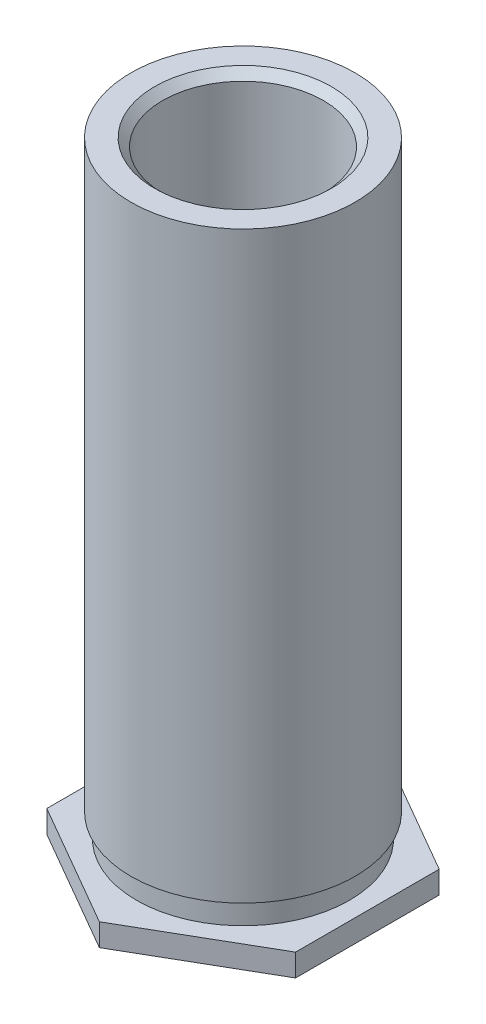
ISO-10303-21;
HEADER;
FILE_DESCRIPTION(('STEP AP214'),'2;1');
FILE_NAME('part.step','',(''),(''),'','','');
FILE_SCHEMA(('AUTOMOTIVE_DESIGN { 1 0 10303 214 1 1 1 1 }'));
ENDSEC;
DATA;
#1=APPLICATION_CONTEXT('core data for automotive mechanical design processes');
#2=APPLICATION_PROTOCOL_DEFINITION('international standard','automotive_design',2000,#1);
#3=PRODUCT_CONTEXT('',#1,'mechanical');
#4=PRODUCT('Part','Part','',(#3));
#5=PRODUCT_RELATED_PRODUCT_CATEGORY('part','',(#4));
#6=PRODUCT_DEFINITION_FORMATION('','',#4);
#7=PRODUCT_DEFINITION_CONTEXT('part definition',#1,'design');
#8=PRODUCT_DEFINITION('design','',#6,#7);
#9=PRODUCT_DEFINITION_SHAPE('','',#8);
#10=(LENGTH_UNIT() NAMED_UNIT(*) SI_UNIT(.MILLI.,.METRE.));
#11=(NAMED_UNIT(*) PLANE_ANGLE_UNIT() SI_UNIT($,.RADIAN.));
#12=(NAMED_UNIT(*) SI_UNIT($,.STERADIAN.) SOLID_ANGLE_UNIT());
#13=UNCERTAINTY_MEASURE_WITH_UNIT(LENGTH_MEASURE(1.E-05),#10,'distance_accuracy_value','');
#14=(GEOMETRIC_REPRESENTATION_CONTEXT(3) GLOBAL_UNCERTAINTY_ASSIGNED_CONTEXT((#13)) GLOBAL_UNIT_ASSIGNED_CONTEXT((#10,
#11,#12)) REPRESENTATION_CONTEXT('',''));
#15=CARTESIAN_POINT('',(0.,0.,0.));
#16=DIRECTION('',(0.,0.,1.));
#17=DIRECTION('',(1.,0.,0.));
#18=AXIS2_PLACEMENT_3D('',#15,#16,#17);
#19=CARTESIAN_POINT('',(4.582,0.712,0.));
#20=DIRECTION('',(0.,1.,0.));
#21=DIRECTION('',(0.,0.,1.));
#22=AXIS2_PLACEMENT_3D('',#19,#20,#21);
#23=PLANE('',#22);
#24=CARTESIAN_POINT('',(0.,0.712,0.));
#25=DIRECTION('',(0.,-1.,0.));
#26=DIRECTION('',(0.,0.,-1.));
#27=AXIS2_PLACEMENT_3D('',#24,#25,#26);
#28=CIRCLE('',#27,3.382);
#29=CARTESIAN_POINT('',(0.,0.712,-3.382));
#30=VERTEX_POINT('',#29);
#31=EDGE_CURVE('E143',#30,#30,#28,.T.);
#32=ORIENTED_EDGE('',*,*,#31,.T.);
#33=EDGE_LOOP('',(#32));
#34=FACE_BOUND('',#33,.T.);
#35=DIRECTION('',(0.866025403784439,0.,0.5));
#36=VECTOR('',#35,1.);
#37=CARTESIAN_POINT('',(0.,0.712,4.56106712659804));
#38=LINE('',#37,#36);
#39=CARTESIAN_POINT('',(-3.95,0.712,2.28053356329902));
#40=VERTEX_POINT('',#39);
#41=CARTESIAN_POINT('',(0.,0.712,4.56106712659804));
#42=VERTEX_POINT('',#41);
#43=EDGE_CURVE('E127',#40,#42,#38,.T.);
#44=ORIENTED_EDGE('',*,*,#43,.T.);
#45=DIRECTION('',(0.866025403784439,0.,-0.5));
#46=VECTOR('',#45,1.);
#47=CARTESIAN_POINT('',(3.95,0.712,2.28053356329902));
#48=LINE('',#47,#46);
#49=CARTESIAN_POINT('',(3.95,0.712,2.28053356329902));
#50=VERTEX_POINT('',#49);
#51=EDGE_CURVE('E116',#42,#50,#48,.T.);
#52=ORIENTED_EDGE('',*,*,#51,.T.);
#53=DIRECTION('',(0.,0.,-1.));
#54=VECTOR('',#53,1.);
#55=CARTESIAN_POINT('',(3.95,0.712,-2.28053356329902));
#56=LINE('',#55,#54);
#57=CARTESIAN_POINT('',(3.95,0.712,-2.28053356329902));
#58=VERTEX_POINT('',#57);
#59=EDGE_CURVE('E119',#50,#58,#56,.T.);
#60=ORIENTED_EDGE('',*,*,#59,.T.);
#61=DIRECTION('',(-0.866025403784439,0.,-0.5));
#62=VECTOR('',#61,1.);
#63=CARTESIAN_POINT('',(0.,0.712,-4.56106712659804));
#64=LINE('',#63,#62);
#65=CARTESIAN_POINT('',(0.,0.712,-4.56106712659804));
#66=VERTEX_POINT('',#65);
#67=EDGE_CURVE('E47',#58,#66,#64,.T.);
#68=ORIENTED_EDGE('',*,*,#67,.T.);
#69=DIRECTION('',(-0.866025403784439,0.,0.5));
#70=VECTOR('',#69,1.);
#71=CARTESIAN_POINT('',(-3.95,0.712,-2.28053356329902));
#72=LINE('',#71,#70);
#73=CARTESIAN_POINT('',(-3.95,0.712,-2.28053356329902));
#74=VERTEX_POINT('',#73);
#75=EDGE_CURVE('E92',#66,#74,#72,.T.);
#76=ORIENTED_EDGE('',*,*,#75,.T.);
#77=DIRECTION('',(0.,0.,1.));
#78=VECTOR('',#77,1.);
#79=CARTESIAN_POINT('',(-3.95,0.712,2.28053356329902));
#80=LINE('',#79,#78);
#81=EDGE_CURVE('E124',#74,#40,#80,.T.);
#82=ORIENTED_EDGE('',*,*,#81,.T.);
#83=EDGE_LOOP('',(#44,#52,#60,#68,#76,#82));
#84=FACE_BOUND('',#83,.T.);
#85=ADVANCED_FACE('F32',(#34,#84),#23,.T.);
#86=CARTESIAN_POINT('',(3.56,0.,0.));
#87=DIRECTION('',(0.,-1.,0.));
#88=DIRECTION('',(0.,0.,-1.));
#89=AXIS2_PLACEMENT_3D('',#86,#87,#88);
#90=PLANE('',#89);
#91=CARTESIAN_POINT('',(0.,0.,0.));
#92=DIRECTION('',(0.,-1.,0.));
#93=DIRECTION('',(0.,0.,-1.));
#94=AXIS2_PLACEMENT_3D('',#91,#92,#93);
#95=CIRCLE('',#94,3.56);
#96=CARTESIAN_POINT('',(0.,0.,-3.56));
#97=VERTEX_POINT('',#96);
#98=EDGE_CURVE('E140',#97,#97,#95,.T.);
#99=ORIENTED_EDGE('',*,*,#98,.F.);
#100=EDGE_LOOP('',(#99));
#101=FACE_BOUND('',#100,.T.);
#102=DIRECTION('',(0.,0.,-1.));
#103=VECTOR('',#102,1.);
#104=CARTESIAN_POINT('',(3.95,0.,-2.28053356329902));
#105=LINE('',#104,#103);
#106=CARTESIAN_POINT('',(3.95,0.,2.28053356329902));
#107=VERTEX_POINT('',#106);
#108=CARTESIAN_POINT('',(3.95,0.,-2.28053356329902));
#109=VERTEX_POINT('',#108);
#110=EDGE_CURVE('E102',#107,#109,#105,.T.);
#111=ORIENTED_EDGE('',*,*,#110,.F.);
#112=DIRECTION('',(0.866025403784439,0.,-0.5));
#113=VECTOR('',#112,1.);
#114=CARTESIAN_POINT('',(3.95,0.,2.28053356329902));
#115=LINE('',#114,#113);
#116=CARTESIAN_POINT('',(0.,0.,4.56106712659804));
#117=VERTEX_POINT('',#116);
#118=EDGE_CURVE('E55',#117,#107,#115,.T.);
#119=ORIENTED_EDGE('',*,*,#118,.F.);
#120=DIRECTION('',(0.866025403784439,0.,0.5));
#121=VECTOR('',#120,1.);
#122=CARTESIAN_POINT('',(0.,0.,4.56106712659804));
#123=LINE('',#122,#121);
#124=CARTESIAN_POINT('',(-3.95,0.,2.28053356329902));
#125=VERTEX_POINT('',#124);
#126=EDGE_CURVE('E109',#125,#117,#123,.T.);
#127=ORIENTED_EDGE('',*,*,#126,.F.);
#128=DIRECTION('',(0.,0.,1.));
#129=VECTOR('',#128,1.);
#130=CARTESIAN_POINT('',(-3.95,0.,2.28053356329902));
#131=LINE('',#130,#129);
#132=CARTESIAN_POINT('',(-3.95,0.,-2.28053356329902));
#133=VERTEX_POINT('',#132);
#134=EDGE_CURVE('E107',#133,#125,#131,.T.);
#135=ORIENTED_EDGE('',*,*,#134,.F.);
#136=DIRECTION('',(-0.866025403784439,0.,0.5));
#137=VECTOR('',#136,1.);
#138=CARTESIAN_POINT('',(-3.95,0.,-2.28053356329902));
#139=LINE('',#138,#137);
#140=CARTESIAN_POINT('',(0.,0.,-4.56106712659804));
#141=VERTEX_POINT('',#140);
#142=EDGE_CURVE('E89',#141,#133,#139,.T.);
#143=ORIENTED_EDGE('',*,*,#142,.F.);
#144=DIRECTION('',(-0.866025403784439,0.,-0.5));
#145=VECTOR('',#144,1.);
#146=CARTESIAN_POINT('',(0.,0.,-4.56106712659804));
#147=LINE('',#146,#145);
#148=EDGE_CURVE('E97',#109,#141,#147,.T.);
#149=ORIENTED_EDGE('',*,*,#148,.F.);
#150=EDGE_LOOP('',(#111,#119,#127,#135,#143,#149));
#151=FACE_BOUND('',#150,.T.);
#152=ADVANCED_FACE('F104',(#101,#151),#90,.T.);
#153=CARTESIAN_POINT('',(2.805,0.00507999999999709,0.));
#154=DIRECTION('',(0.,-1.,0.));
#155=DIRECTION('',(0.,0.,-1.));
#156=AXIS2_PLACEMENT_3D('',#153,#154,#155);
#157=PLANE('',#156);
#158=CARTESIAN_POINT('',(0.,0.00507999999999709,0.));
#159=DIRECTION('',(0.,-1.,0.));
#160=DIRECTION('',(0.,0.,-1.));
#161=AXIS2_PLACEMENT_3D('',#158,#159,#160);
#162=CIRCLE('',#161,3.56);
#163=CARTESIAN_POINT('',(0.,0.00507999999999709,-3.56));
#164=VERTEX_POINT('',#163);
#165=EDGE_CURVE('E132',#164,#164,#162,.T.);
#166=ORIENTED_EDGE('',*,*,#165,.T.);
#167=EDGE_LOOP('',(#166));
#168=FACE_BOUND('',#167,.T.);
#169=CARTESIAN_POINT('',(0.,0.00507999999999709,0.));
#170=DIRECTION('',(0.,-1.,0.));
#171=DIRECTION('',(0.,0.,-1.));
#172=AXIS2_PLACEMENT_3D('',#169,#170,#171);
#173=CIRCLE('',#172,2.805);
#174=CARTESIAN_POINT('',(0.,0.00507999999999709,-2.805));
#175=VERTEX_POINT('',#174);
#176=EDGE_CURVE('E11',#175,#175,#173,.T.);
#177=ORIENTED_EDGE('',*,*,#176,.F.);
#178=EDGE_LOOP('',(#177));
#179=FACE_BOUND('',#178,.T.);
#180=ADVANCED_FACE('F34',(#168,#179),#157,.T.);
#181=CARTESIAN_POINT('',(0.,0.26008,0.));
#182=DIRECTION('',(0.,-1.,0.));
#183=DIRECTION('',(0.,0.,-1.));
#184=AXIS2_PLACEMENT_3D('',#181,#182,#183);
#185=CONICAL_SURFACE('',#184,2.55,0.785398163397448);
#186=ORIENTED_EDGE('',*,*,#176,.T.);
#187=EDGE_LOOP('',(#186));
#188=FACE_BOUND('',#187,.T.);
#189=CARTESIAN_POINT('',(0.,0.26008,0.));
#190=DIRECTION('',(0.,-1.,0.));
#191=DIRECTION('',(0.,0.,-1.));
#192=AXIS2_PLACEMENT_3D('',#189,#190,#191);
#193=CIRCLE('',#192,2.55);
#194=CARTESIAN_POINT('',(0.,0.26008,-2.55));
#195=VERTEX_POINT('',#194);
#196=EDGE_CURVE('E40',#195,#195,#193,.T.);
#197=ORIENTED_EDGE('',*,*,#196,.F.);
#198=EDGE_LOOP('',(#197));
#199=FACE_BOUND('',#198,.T.);
#200=ADVANCED_FACE('F166',(#188,#199),#185,.F.);
#201=CARTESIAN_POINT('',(0.,0.,0.));
#202=DIRECTION('',(0.,-1.,0.));
#203=DIRECTION('',(0.,0.,-1.));
#204=AXIS2_PLACEMENT_3D('',#201,#202,#203);
#205=CYLINDRICAL_SURFACE('',#204,2.55);
#206=ORIENTED_EDGE('',*,*,#196,.T.);
#207=EDGE_LOOP('',(#206));
#208=FACE_BOUND('',#207,.T.);
#209=CARTESIAN_POINT('',(0.,19.745,0.));
#210=DIRECTION('',(0.,-1.,0.));
#211=DIRECTION('',(0.,0.,-1.));
#212=AXIS2_PLACEMENT_3D('',#209,#210,#211);
#213=CIRCLE('',#212,2.55);
#214=CARTESIAN_POINT('',(0.,19.745,-2.55));
#215=VERTEX_POINT('',#214);
#216=EDGE_CURVE('E158',#215,#215,#213,.T.);
#217=ORIENTED_EDGE('',*,*,#216,.F.);
#218=EDGE_LOOP('',(#217));
#219=FACE_BOUND('',#218,.T.);
#220=ADVANCED_FACE('F163',(#208,#219),#205,.F.);
#221=CARTESIAN_POINT('',(0.,20.,0.));
#222=DIRECTION('',(0.,1.,0.));
#223=DIRECTION('',(0.,0.,1.));
#224=AXIS2_PLACEMENT_3D('',#221,#222,#223);
#225=CONICAL_SURFACE('',#224,2.805,0.78539816339745);
#226=ORIENTED_EDGE('',*,*,#216,.T.);
#227=EDGE_LOOP('',(#226));
#228=FACE_BOUND('',#227,.T.);
#229=CARTESIAN_POINT('',(0.,20.,0.));
#230=DIRECTION('',(0.,-1.,0.));
#231=DIRECTION('',(0.,0.,-1.));
#232=AXIS2_PLACEMENT_3D('',#229,#230,#231);
#233=CIRCLE('',#232,2.805);
#234=CARTESIAN_POINT('',(0.,20.,-2.805));
#235=VERTEX_POINT('',#234);
#236=EDGE_CURVE('E155',#235,#235,#233,.T.);
#237=ORIENTED_EDGE('',*,*,#236,.F.);
#238=EDGE_LOOP('',(#237));
#239=FACE_BOUND('',#238,.T.);
#240=ADVANCED_FACE('F173',(#228,#239),#225,.F.);
#241=CARTESIAN_POINT('',(3.56,20.,0.));
#242=DIRECTION('',(0.,1.,0.));
#243=DIRECTION('',(0.,0.,1.));
#244=AXIS2_PLACEMENT_3D('',#241,#242,#243);
#245=PLANE('',#244);
#246=ORIENTED_EDGE('',*,*,#236,.T.);
#247=EDGE_LOOP('',(#246));
#248=FACE_BOUND('',#247,.T.);
#249=CARTESIAN_POINT('',(0.,20.,0.));
#250=DIRECTION('',(0.,-1.,0.));
#251=DIRECTION('',(0.,0.,-1.));
#252=AXIS2_PLACEMENT_3D('',#249,#250,#251);
#253=CIRCLE('',#252,3.56);
#254=CARTESIAN_POINT('',(0.,20.,-3.56));
#255=VERTEX_POINT('',#254);
#256=EDGE_CURVE('E152',#255,#255,#253,.T.);
#257=ORIENTED_EDGE('',*,*,#256,.F.);
#258=EDGE_LOOP('',(#257));
#259=FACE_BOUND('',#258,.T.);
#260=ADVANCED_FACE('F199',(#248,#259),#245,.T.);
#261=CARTESIAN_POINT('',(0.,0.,0.));
#262=DIRECTION('',(0.,-1.,0.));
#263=DIRECTION('',(0.,0.,-1.));
#264=AXIS2_PLACEMENT_3D('',#261,#262,#263);
#265=CYLINDRICAL_SURFACE('',#264,3.56);
#266=ORIENTED_EDGE('',*,*,#256,.T.);
#267=EDGE_LOOP('',(#266));
#268=FACE_BOUND('',#267,.T.);
#269=CARTESIAN_POINT('',(0.,1.4596,0.));
#270=DIRECTION('',(0.,-1.,0.));
#271=DIRECTION('',(0.,0.,-1.));
#272=AXIS2_PLACEMENT_3D('',#269,#270,#271);
#273=CIRCLE('',#272,3.56);
#274=CARTESIAN_POINT('',(0.,1.4596,-3.56));
#275=VERTEX_POINT('',#274);
#276=EDGE_CURVE('E149',#275,#275,#273,.T.);
#277=ORIENTED_EDGE('',*,*,#276,.F.);
#278=EDGE_LOOP('',(#277));
#279=FACE_BOUND('',#278,.T.);
#280=ADVANCED_FACE('F195',(#268,#279),#265,.T.);
#281=CARTESIAN_POINT('',(3.56,1.4596,0.));
#282=DIRECTION('',(0.,-1.,0.));
#283=DIRECTION('',(0.,0.,-1.));
#284=AXIS2_PLACEMENT_3D('',#281,#282,#283);
#285=PLANE('',#284);
#286=ORIENTED_EDGE('',*,*,#276,.T.);
#287=EDGE_LOOP('',(#286));
#288=FACE_BOUND('',#287,.T.);
#289=CARTESIAN_POINT('',(0.,1.4596,0.));
#290=DIRECTION('',(0.,-1.,0.));
#291=DIRECTION('',(0.,0.,-1.));
#292=AXIS2_PLACEMENT_3D('',#289,#290,#291);
#293=CIRCLE('',#292,3.382);
#294=CARTESIAN_POINT('',(0.,1.4596,-3.382));
#295=VERTEX_POINT('',#294);
#296=EDGE_CURVE('E146',#295,#295,#293,.T.);
#297=ORIENTED_EDGE('',*,*,#296,.F.);
#298=EDGE_LOOP('',(#297));
#299=FACE_BOUND('',#298,.T.);
#300=ADVANCED_FACE('F191',(#288,#299),#285,.T.);
#301=CARTESIAN_POINT('',(0.,0.,0.));
#302=DIRECTION('',(0.,-1.,0.));
#303=DIRECTION('',(0.,0.,-1.));
#304=AXIS2_PLACEMENT_3D('',#301,#302,#303);
#305=CYLINDRICAL_SURFACE('',#304,3.382);
#306=ORIENTED_EDGE('',*,*,#296,.T.);
#307=EDGE_LOOP('',(#306));
#308=FACE_BOUND('',#307,.T.);
#309=ORIENTED_EDGE('',*,*,#31,.F.);
#310=EDGE_LOOP('',(#309));
#311=FACE_BOUND('',#310,.T.);
#312=ADVANCED_FACE('F187',(#308,#311),#305,.T.);
#313=CARTESIAN_POINT('',(0.,0.,0.));
#314=DIRECTION('',(0.,-1.,0.));
#315=DIRECTION('',(0.,0.,-1.));
#316=AXIS2_PLACEMENT_3D('',#313,#314,#315);
#317=CYLINDRICAL_SURFACE('',#316,3.56);
#318=ORIENTED_EDGE('',*,*,#98,.T.);
#319=EDGE_LOOP('',(#318));
#320=FACE_BOUND('',#319,.T.);
#321=ORIENTED_EDGE('',*,*,#165,.F.);
#322=EDGE_LOOP('',(#321));
#323=FACE_BOUND('',#322,.T.);
#324=ADVANCED_FACE('F190',(#320,#323),#317,.F.);
#325=CARTESIAN_POINT('',(3.95,0.,2.28053356329902));
#326=DIRECTION('',(0.5,0.,0.866025403784439));
#327=DIRECTION('',(0.866025403784439,0.,-0.5));
#328=AXIS2_PLACEMENT_3D('',#325,#326,#327);
#329=PLANE('',#328);
#330=ORIENTED_EDGE('',*,*,#51,.F.);
#331=DIRECTION('',(0.,1.,0.));
#332=VECTOR('',#331,1.);
#333=CARTESIAN_POINT('',(0.,0.,4.56106712659804));
#334=LINE('',#333,#332);
#335=EDGE_CURVE('E130',#117,#42,#334,.T.);
#336=ORIENTED_EDGE('',*,*,#335,.F.);
#337=ORIENTED_EDGE('',*,*,#118,.T.);
#338=DIRECTION('',(0.,1.,0.));
#339=VECTOR('',#338,1.);
#340=CARTESIAN_POINT('',(3.95,0.,2.28053356329902));
#341=LINE('',#340,#339);
#342=EDGE_CURVE('E115',#107,#50,#341,.T.);
#343=ORIENTED_EDGE('',*,*,#342,.T.);
#344=EDGE_LOOP('',(#330,#336,#337,#343));
#345=FACE_BOUND('',#344,.T.);
#346=ADVANCED_FACE('F243',(#345),#329,.T.);
#347=CARTESIAN_POINT('',(0.,0.,4.56106712659804));
#348=DIRECTION('',(-0.5,0.,0.866025403784439));
#349=DIRECTION('',(0.866025403784439,0.,0.5));
#350=AXIS2_PLACEMENT_3D('',#347,#348,#349);
#351=PLANE('',#350);
#352=ORIENTED_EDGE('',*,*,#43,.F.);
#353=DIRECTION('',(0.,1.,0.));
#354=VECTOR('',#353,1.);
#355=CARTESIAN_POINT('',(-3.95,0.,2.28053356329902));
#356=LINE('',#355,#354);
#357=EDGE_CURVE('E133',#125,#40,#356,.T.);
#358=ORIENTED_EDGE('',*,*,#357,.F.);
#359=ORIENTED_EDGE('',*,*,#126,.T.);
#360=ORIENTED_EDGE('',*,*,#335,.T.);
#361=EDGE_LOOP('',(#352,#358,#359,#360));
#362=FACE_BOUND('',#361,.T.);
#363=ADVANCED_FACE('F250',(#362),#351,.T.);
#364=CARTESIAN_POINT('',(-3.95,0.,2.28053356329902));
#365=DIRECTION('',(-1.,0.,0.));
#366=DIRECTION('',(0.,0.,1.));
#367=AXIS2_PLACEMENT_3D('',#364,#365,#366);
#368=PLANE('',#367);
#369=ORIENTED_EDGE('',*,*,#81,.F.);
#370=DIRECTION('',(0.,1.,0.));
#371=VECTOR('',#370,1.);
#372=CARTESIAN_POINT('',(-3.95,0.,-2.28053356329902));
#373=LINE('',#372,#371);
#374=EDGE_CURVE('E93',#133,#74,#373,.T.);
#375=ORIENTED_EDGE('',*,*,#374,.F.);
#376=ORIENTED_EDGE('',*,*,#134,.T.);
#377=ORIENTED_EDGE('',*,*,#357,.T.);
#378=EDGE_LOOP('',(#369,#375,#376,#377));
#379=FACE_BOUND('',#378,.T.);
#380=ADVANCED_FACE('F258',(#379),#368,.T.);
#381=CARTESIAN_POINT('',(-3.95,0.,-2.28053356329902));
#382=DIRECTION('',(-0.5,0.,-0.866025403784439));
#383=DIRECTION('',(-0.866025403784439,0.,0.5));
#384=AXIS2_PLACEMENT_3D('',#381,#382,#383);
#385=PLANE('',#384);
#386=ORIENTED_EDGE('',*,*,#75,.F.);
#387=DIRECTION('',(0.,1.,0.));
#388=VECTOR('',#387,1.);
#389=CARTESIAN_POINT('',(0.,0.,-4.56106712659804));
#390=LINE('',#389,#388);
#391=EDGE_CURVE('E85',#141,#66,#390,.T.);
#392=ORIENTED_EDGE('',*,*,#391,.F.);
#393=ORIENTED_EDGE('',*,*,#142,.T.);
#394=ORIENTED_EDGE('',*,*,#374,.T.);
#395=EDGE_LOOP('',(#386,#392,#393,#394));
#396=FACE_BOUND('',#395,.T.);
#397=ADVANCED_FACE('F87',(#396),#385,.T.);
#398=CARTESIAN_POINT('',(0.,0.,-4.56106712659804));
#399=DIRECTION('',(0.5,0.,-0.866025403784439));
#400=DIRECTION('',(-0.866025403784439,0.,-0.5));
#401=AXIS2_PLACEMENT_3D('',#398,#399,#400);
#402=PLANE('',#401);
#403=ORIENTED_EDGE('',*,*,#67,.F.);
#404=DIRECTION('',(0.,1.,0.));
#405=VECTOR('',#404,1.);
#406=CARTESIAN_POINT('',(3.95,0.,-2.28053356329902));
#407=LINE('',#406,#405);
#408=EDGE_CURVE('E94',#109,#58,#407,.T.);
#409=ORIENTED_EDGE('',*,*,#408,.F.);
#410=ORIENTED_EDGE('',*,*,#148,.T.);
#411=ORIENTED_EDGE('',*,*,#391,.T.);
#412=EDGE_LOOP('',(#403,#409,#410,#411));
#413=FACE_BOUND('',#412,.T.);
#414=ADVANCED_FACE('F98',(#413),#402,.T.);
#415=CARTESIAN_POINT('',(3.95,0.,-2.28053356329902));
#416=DIRECTION('',(1.,0.,0.));
#417=DIRECTION('',(0.,0.,-1.));
#418=AXIS2_PLACEMENT_3D('',#415,#416,#417);
#419=PLANE('',#418);
#420=ORIENTED_EDGE('',*,*,#59,.F.);
#421=ORIENTED_EDGE('',*,*,#342,.F.);
#422=ORIENTED_EDGE('',*,*,#110,.T.);
#423=ORIENTED_EDGE('',*,*,#408,.T.);
#424=EDGE_LOOP('',(#420,#421,#422,#423));
#425=FACE_BOUND('',#424,.T.);
#426=ADVANCED_FACE('F279',(#425),#419,.T.);
#427=CLOSED_SHELL('',(#85,#152,#180,#200,#220,#240,#260,#280,#300,#312,#324,#346,#363,#380,#397,
#414,#426));
#428=MANIFOLD_SOLID_BREP('B2',#427);
#429=ADVANCED_BREP_SHAPE_REPRESENTATION('',(#18,#428),#14);
#430=SHAPE_DEFINITION_REPRESENTATION(#9,#429);
ENDSEC;
END-ISO-10303-21;
